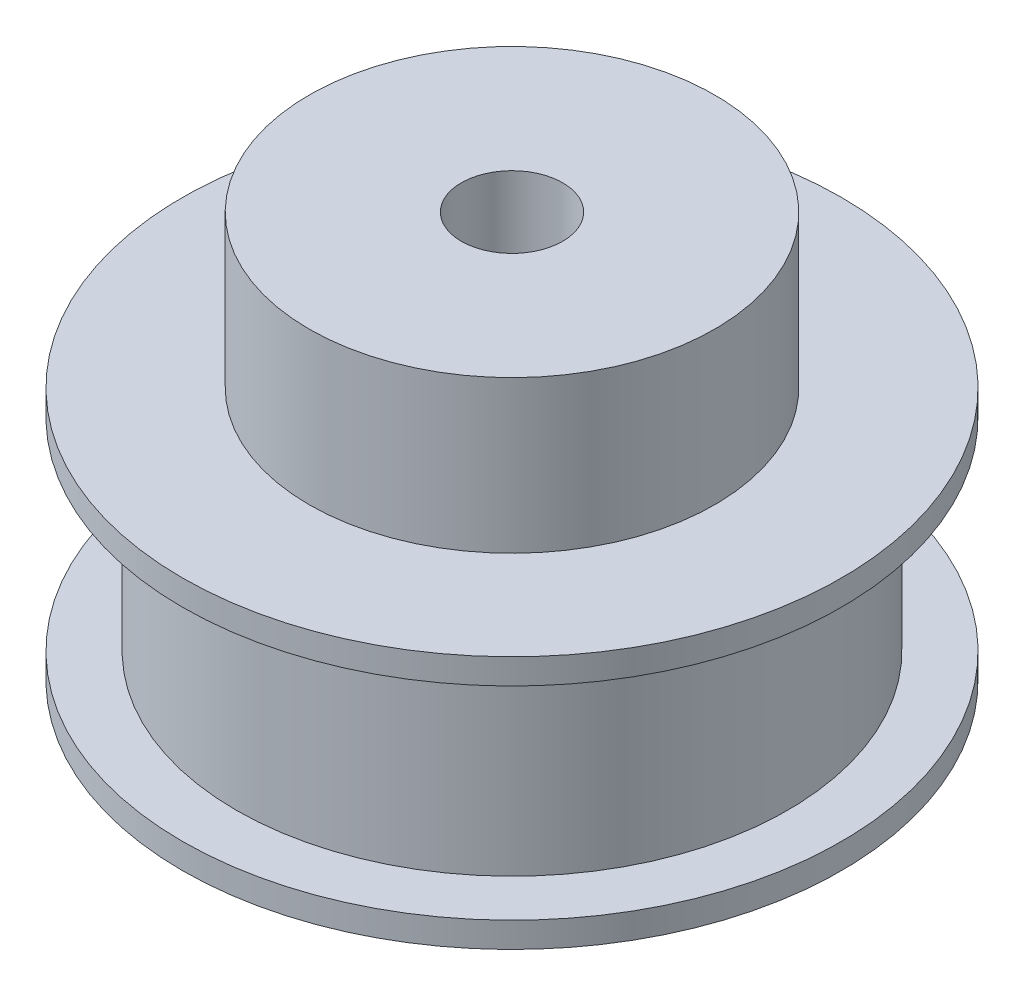
ISO-10303-21;
HEADER;
FILE_DESCRIPTION(('STEP AP214'),'2;1');
FILE_NAME('part.step','',(''),(''),'','','');
FILE_SCHEMA(('AUTOMOTIVE_DESIGN { 1 0 10303 214 1 1 1 1 }'));
ENDSEC;
DATA;
#1=APPLICATION_CONTEXT('core data for automotive mechanical design processes');
#2=APPLICATION_PROTOCOL_DEFINITION('international standard','automotive_design',2000,#1);
#3=PRODUCT_CONTEXT('',#1,'mechanical');
#4=PRODUCT('Part','Part','',(#3));
#5=PRODUCT_RELATED_PRODUCT_CATEGORY('part','',(#4));
#6=PRODUCT_DEFINITION_FORMATION('','',#4);
#7=PRODUCT_DEFINITION_CONTEXT('part definition',#1,'design');
#8=PRODUCT_DEFINITION('design','',#6,#7);
#9=PRODUCT_DEFINITION_SHAPE('','',#8);
#10=(LENGTH_UNIT() NAMED_UNIT(*) SI_UNIT(.MILLI.,.METRE.));
#11=(NAMED_UNIT(*) PLANE_ANGLE_UNIT() SI_UNIT($,.RADIAN.));
#12=(NAMED_UNIT(*) SI_UNIT($,.STERADIAN.) SOLID_ANGLE_UNIT());
#13=UNCERTAINTY_MEASURE_WITH_UNIT(LENGTH_MEASURE(1.E-05),#10,'distance_accuracy_value','');
#14=(GEOMETRIC_REPRESENTATION_CONTEXT(3) GLOBAL_UNCERTAINTY_ASSIGNED_CONTEXT((#13)) GLOBAL_UNIT_ASSIGNED_CONTEXT((#10,
#11,#12)) REPRESENTATION_CONTEXT('',''));
#15=CARTESIAN_POINT('',(0.,0.,0.));
#16=DIRECTION('',(0.,0.,1.));
#17=DIRECTION('',(1.,0.,0.));
#18=AXIS2_PLACEMENT_3D('',#15,#16,#17);
#19=CARTESIAN_POINT('',(0.,10.,0.));
#20=DIRECTION('',(0.,1.,0.));
#21=DIRECTION('',(0.,0.,1.));
#22=AXIS2_PLACEMENT_3D('',#19,#20,#21);
#23=PLANE('',#22);
#24=CARTESIAN_POINT('',(0.,10.,0.));
#25=DIRECTION('',(0.,1.,0.));
#26=DIRECTION('',(0.,0.,1.));
#27=AXIS2_PLACEMENT_3D('',#24,#25,#26);
#28=CIRCLE('',#27,13.);
#29=CARTESIAN_POINT('',(0.,10.,13.));
#30=VERTEX_POINT('',#29);
#31=EDGE_CURVE('E45',#30,#30,#28,.T.);
#32=ORIENTED_EDGE('',*,*,#31,.T.);
#33=EDGE_LOOP('',(#32));
#34=FACE_BOUND('',#33,.T.);
#35=CARTESIAN_POINT('',(0.,10.,0.));
#36=DIRECTION('',(0.,1.,0.));
#37=DIRECTION('',(0.,0.,1.));
#38=AXIS2_PLACEMENT_3D('',#35,#36,#37);
#39=CIRCLE('',#38,8.);
#40=CARTESIAN_POINT('',(0.,10.,8.));
#41=VERTEX_POINT('',#40);
#42=EDGE_CURVE('E54',#41,#41,#39,.T.);
#43=ORIENTED_EDGE('',*,*,#42,.F.);
#44=EDGE_LOOP('',(#43));
#45=FACE_BOUND('',#44,.T.);
#46=ADVANCED_FACE('F29',(#34,#45),#23,.T.);
#47=CARTESIAN_POINT('',(0.,1.,0.));
#48=DIRECTION('',(0.,1.,0.));
#49=DIRECTION('',(0.,0.,1.));
#50=AXIS2_PLACEMENT_3D('',#47,#48,#49);
#51=PLANE('',#50);
#52=CARTESIAN_POINT('',(0.,1.,0.));
#53=DIRECTION('',(0.,1.,0.));
#54=DIRECTION('',(0.,0.,1.));
#55=AXIS2_PLACEMENT_3D('',#52,#53,#54);
#56=CIRCLE('',#55,13.);
#57=CARTESIAN_POINT('',(0.,1.,13.));
#58=VERTEX_POINT('',#57);
#59=EDGE_CURVE('E10',#58,#58,#56,.T.);
#60=ORIENTED_EDGE('',*,*,#59,.T.);
#61=EDGE_LOOP('',(#60));
#62=FACE_BOUND('',#61,.T.);
#63=CARTESIAN_POINT('',(0.,1.,0.));
#64=DIRECTION('',(0.,1.,0.));
#65=DIRECTION('',(0.,0.,1.));
#66=AXIS2_PLACEMENT_3D('',#63,#64,#65);
#67=CIRCLE('',#66,10.875);
#68=CARTESIAN_POINT('',(0.,1.,10.875));
#69=VERTEX_POINT('',#68);
#70=EDGE_CURVE('E42',#69,#69,#67,.T.);
#71=ORIENTED_EDGE('',*,*,#70,.F.);
#72=EDGE_LOOP('',(#71));
#73=FACE_BOUND('',#72,.T.);
#74=ADVANCED_FACE('F89',(#62,#73),#51,.T.);
#75=CARTESIAN_POINT('',(0.,1.,0.));
#76=DIRECTION('',(0.,-1.,0.));
#77=DIRECTION('',(0.,0.,-1.));
#78=AXIS2_PLACEMENT_3D('',#75,#76,#77);
#79=CYLINDRICAL_SURFACE('',#78,13.);
#80=ORIENTED_EDGE('',*,*,#59,.F.);
#81=EDGE_LOOP('',(#80));
#82=FACE_BOUND('',#81,.T.);
#83=CARTESIAN_POINT('',(0.,0.,0.));
#84=DIRECTION('',(0.,1.,0.));
#85=DIRECTION('',(0.,0.,1.));
#86=AXIS2_PLACEMENT_3D('',#83,#84,#85);
#87=CIRCLE('',#86,13.);
#88=CARTESIAN_POINT('',(0.,0.,13.));
#89=VERTEX_POINT('',#88);
#90=EDGE_CURVE('E33',#89,#89,#87,.T.);
#91=ORIENTED_EDGE('',*,*,#90,.T.);
#92=EDGE_LOOP('',(#91));
#93=FACE_BOUND('',#92,.T.);
#94=ADVANCED_FACE('F31',(#82,#93),#79,.T.);
#95=CARTESIAN_POINT('',(0.,0.,0.));
#96=DIRECTION('',(0.,1.,0.));
#97=DIRECTION('',(0.,0.,1.));
#98=AXIS2_PLACEMENT_3D('',#95,#96,#97);
#99=PLANE('',#98);
#100=CARTESIAN_POINT('',(0.,0.,0.));
#101=DIRECTION('',(0.,1.,0.));
#102=DIRECTION('',(0.,0.,1.));
#103=AXIS2_PLACEMENT_3D('',#100,#101,#102);
#104=CIRCLE('',#103,2.);
#105=CARTESIAN_POINT('',(0.,0.,2.));
#106=VERTEX_POINT('',#105);
#107=EDGE_CURVE('E57',#106,#106,#104,.T.);
#108=ORIENTED_EDGE('',*,*,#107,.T.);
#109=EDGE_LOOP('',(#108));
#110=FACE_BOUND('',#109,.T.);
#111=ORIENTED_EDGE('',*,*,#90,.F.);
#112=EDGE_LOOP('',(#111));
#113=FACE_BOUND('',#112,.T.);
#114=ADVANCED_FACE('F66',(#110,#113),#99,.F.);
#115=CARTESIAN_POINT('',(0.,9.,0.));
#116=DIRECTION('',(0.,-1.,0.));
#117=DIRECTION('',(0.,0.,-1.));
#118=AXIS2_PLACEMENT_3D('',#115,#116,#117);
#119=CYLINDRICAL_SURFACE('',#118,10.875);
#120=CARTESIAN_POINT('',(0.,9.,0.));
#121=DIRECTION('',(0.,1.,0.));
#122=DIRECTION('',(0.,0.,1.));
#123=AXIS2_PLACEMENT_3D('',#120,#121,#122);
#124=CIRCLE('',#123,10.875);
#125=CARTESIAN_POINT('',(0.,9.,10.875));
#126=VERTEX_POINT('',#125);
#127=EDGE_CURVE('E40',#126,#126,#124,.T.);
#128=ORIENTED_EDGE('',*,*,#127,.F.);
#129=EDGE_LOOP('',(#128));
#130=FACE_BOUND('',#129,.T.);
#131=ORIENTED_EDGE('',*,*,#70,.T.);
#132=EDGE_LOOP('',(#131));
#133=FACE_BOUND('',#132,.T.);
#134=ADVANCED_FACE('F100',(#130,#133),#119,.T.);
#135=CARTESIAN_POINT('',(0.,9.,0.));
#136=DIRECTION('',(0.,1.,0.));
#137=DIRECTION('',(0.,0.,1.));
#138=AXIS2_PLACEMENT_3D('',#135,#136,#137);
#139=PLANE('',#138);
#140=CARTESIAN_POINT('',(0.,9.,0.));
#141=DIRECTION('',(0.,1.,0.));
#142=DIRECTION('',(0.,0.,1.));
#143=AXIS2_PLACEMENT_3D('',#140,#141,#142);
#144=CIRCLE('',#143,13.);
#145=CARTESIAN_POINT('',(0.,9.,13.));
#146=VERTEX_POINT('',#145);
#147=EDGE_CURVE('E48',#146,#146,#144,.T.);
#148=ORIENTED_EDGE('',*,*,#147,.F.);
#149=EDGE_LOOP('',(#148));
#150=FACE_BOUND('',#149,.T.);
#151=ORIENTED_EDGE('',*,*,#127,.T.);
#152=EDGE_LOOP('',(#151));
#153=FACE_BOUND('',#152,.T.);
#154=ADVANCED_FACE('F97',(#150,#153),#139,.F.);
#155=CARTESIAN_POINT('',(0.,10.,0.));
#156=DIRECTION('',(0.,-1.,0.));
#157=DIRECTION('',(0.,0.,-1.));
#158=AXIS2_PLACEMENT_3D('',#155,#156,#157);
#159=CYLINDRICAL_SURFACE('',#158,13.);
#160=ORIENTED_EDGE('',*,*,#31,.F.);
#161=EDGE_LOOP('',(#160));
#162=FACE_BOUND('',#161,.T.);
#163=ORIENTED_EDGE('',*,*,#147,.T.);
#164=EDGE_LOOP('',(#163));
#165=FACE_BOUND('',#164,.T.);
#166=ADVANCED_FACE('F84',(#162,#165),#159,.T.);
#167=CARTESIAN_POINT('',(0.,16.,0.));
#168=DIRECTION('',(0.,-1.,0.));
#169=DIRECTION('',(0.,0.,-1.));
#170=AXIS2_PLACEMENT_3D('',#167,#168,#169);
#171=CYLINDRICAL_SURFACE('',#170,8.);
#172=CARTESIAN_POINT('',(0.,16.,0.));
#173=DIRECTION('',(0.,1.,0.));
#174=DIRECTION('',(0.,0.,1.));
#175=AXIS2_PLACEMENT_3D('',#172,#173,#174);
#176=CIRCLE('',#175,8.);
#177=CARTESIAN_POINT('',(0.,16.,8.));
#178=VERTEX_POINT('',#177);
#179=EDGE_CURVE('E51',#178,#178,#176,.T.);
#180=ORIENTED_EDGE('',*,*,#179,.F.);
#181=EDGE_LOOP('',(#180));
#182=FACE_BOUND('',#181,.T.);
#183=ORIENTED_EDGE('',*,*,#42,.T.);
#184=EDGE_LOOP('',(#183));
#185=FACE_BOUND('',#184,.T.);
#186=ADVANCED_FACE('F78',(#182,#185),#171,.T.);
#187=CARTESIAN_POINT('',(0.,16.,0.));
#188=DIRECTION('',(0.,1.,0.));
#189=DIRECTION('',(0.,0.,1.));
#190=AXIS2_PLACEMENT_3D('',#187,#188,#189);
#191=PLANE('',#190);
#192=CARTESIAN_POINT('',(0.,16.,0.));
#193=DIRECTION('',(0.,1.,0.));
#194=DIRECTION('',(0.,0.,1.));
#195=AXIS2_PLACEMENT_3D('',#192,#193,#194);
#196=CIRCLE('',#195,2.);
#197=CARTESIAN_POINT('',(0.,16.,2.));
#198=VERTEX_POINT('',#197);
#199=EDGE_CURVE('E60',#198,#198,#196,.T.);
#200=ORIENTED_EDGE('',*,*,#199,.F.);
#201=EDGE_LOOP('',(#200));
#202=FACE_BOUND('',#201,.T.);
#203=ORIENTED_EDGE('',*,*,#179,.T.);
#204=EDGE_LOOP('',(#203));
#205=FACE_BOUND('',#204,.T.);
#206=ADVANCED_FACE('F72',(#202,#205),#191,.T.);
#207=CARTESIAN_POINT('',(0.,0.,0.));
#208=DIRECTION('',(0.,1.,0.));
#209=DIRECTION('',(0.,0.,1.));
#210=AXIS2_PLACEMENT_3D('',#207,#208,#209);
#211=CYLINDRICAL_SURFACE('',#210,2.);
#212=ORIENTED_EDGE('',*,*,#107,.F.);
#213=EDGE_LOOP('',(#212));
#214=FACE_BOUND('',#213,.T.);
#215=ORIENTED_EDGE('',*,*,#199,.T.);
#216=EDGE_LOOP('',(#215));
#217=FACE_BOUND('',#216,.T.);
#218=ADVANCED_FACE('F69',(#214,#217),#211,.F.);
#219=CLOSED_SHELL('',(#46,#74,#94,#114,#134,#154,#166,#186,#206,#218));
#220=MANIFOLD_SOLID_BREP('B2',#219);
#221=ADVANCED_BREP_SHAPE_REPRESENTATION('',(#18,#220),#14);
#222=SHAPE_DEFINITION_REPRESENTATION(#9,#221);
ENDSEC;
END-ISO-10303-21;
